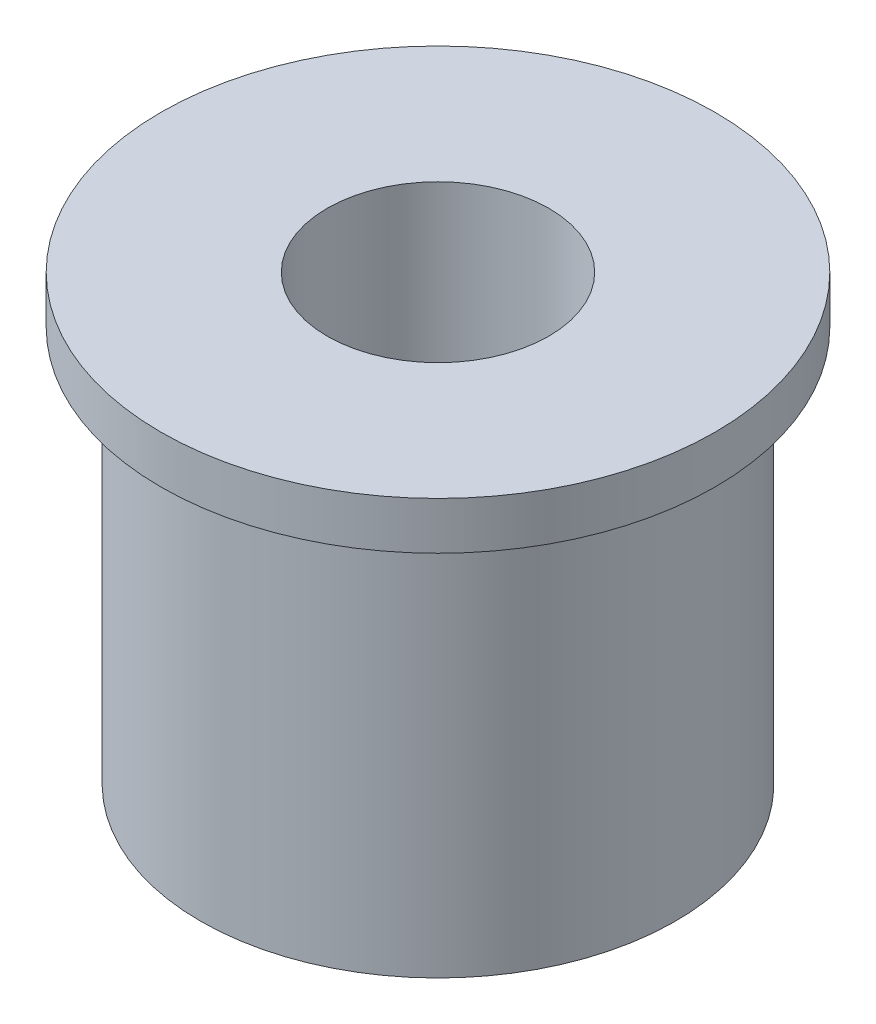
ISO-10303-21;
HEADER;
FILE_DESCRIPTION(('STEP AP214'),'2;1');
FILE_NAME('part.step','',(''),(''),'','','');
FILE_SCHEMA(('AUTOMOTIVE_DESIGN { 1 0 10303 214 1 1 1 1 }'));
ENDSEC;
DATA;
#1=APPLICATION_CONTEXT('core data for automotive mechanical design processes');
#2=APPLICATION_PROTOCOL_DEFINITION('international standard','automotive_design',2000,#1);
#3=PRODUCT_CONTEXT('',#1,'mechanical');
#4=PRODUCT('Part','Part','',(#3));
#5=PRODUCT_RELATED_PRODUCT_CATEGORY('part','',(#4));
#6=PRODUCT_DEFINITION_FORMATION('','',#4);
#7=PRODUCT_DEFINITION_CONTEXT('part definition',#1,'design');
#8=PRODUCT_DEFINITION('design','',#6,#7);
#9=PRODUCT_DEFINITION_SHAPE('','',#8);
#10=(LENGTH_UNIT() NAMED_UNIT(*) SI_UNIT(.MILLI.,.METRE.));
#11=(NAMED_UNIT(*) PLANE_ANGLE_UNIT() SI_UNIT($,.RADIAN.));
#12=(NAMED_UNIT(*) SI_UNIT($,.STERADIAN.) SOLID_ANGLE_UNIT());
#13=UNCERTAINTY_MEASURE_WITH_UNIT(LENGTH_MEASURE(1.E-05),#10,'distance_accuracy_value','');
#14=(GEOMETRIC_REPRESENTATION_CONTEXT(3) GLOBAL_UNCERTAINTY_ASSIGNED_CONTEXT((#13)) GLOBAL_UNIT_ASSIGNED_CONTEXT((#10,
#11,#12)) REPRESENTATION_CONTEXT('',''));
#15=CARTESIAN_POINT('',(0.,0.,0.));
#16=DIRECTION('',(0.,0.,1.));
#17=DIRECTION('',(1.,0.,0.));
#18=AXIS2_PLACEMENT_3D('',#15,#16,#17);
#19=CARTESIAN_POINT('',(0.,0.,0.));
#20=DIRECTION('',(0.,1.,0.));
#21=DIRECTION('',(0.,0.,1.));
#22=AXIS2_PLACEMENT_3D('',#19,#20,#21);
#23=PLANE('',#22);
#24=CARTESIAN_POINT('',(0.,0.,0.));
#25=DIRECTION('',(0.,1.,0.));
#26=DIRECTION('',(0.,0.,1.));
#27=AXIS2_PLACEMENT_3D('',#24,#25,#26);
#28=CIRCLE('',#27,3.);
#29=CARTESIAN_POINT('',(0.,0.,3.));
#30=VERTEX_POINT('',#29);
#31=EDGE_CURVE('E36',#30,#30,#28,.T.);
#32=ORIENTED_EDGE('',*,*,#31,.F.);
#33=EDGE_LOOP('',(#32));
#34=FACE_BOUND('',#33,.T.);
#35=CARTESIAN_POINT('',(0.,0.,0.));
#36=DIRECTION('',(0.,1.,0.));
#37=DIRECTION('',(0.,0.,1.));
#38=AXIS2_PLACEMENT_3D('',#35,#36,#37);
#39=CIRCLE('',#38,1.4);
#40=CARTESIAN_POINT('',(0.,0.,1.4));
#41=VERTEX_POINT('',#40);
#42=EDGE_CURVE('E43',#41,#41,#39,.T.);
#43=ORIENTED_EDGE('',*,*,#42,.T.);
#44=EDGE_LOOP('',(#43));
#45=FACE_BOUND('',#44,.T.);
#46=ADVANCED_FACE('F32',(#34,#45),#23,.F.);
#47=CARTESIAN_POINT('',(0.,5.,0.));
#48=DIRECTION('',(0.,-1.,0.));
#49=DIRECTION('',(0.,0.,-1.));
#50=AXIS2_PLACEMENT_3D('',#47,#48,#49);
#51=CYLINDRICAL_SURFACE('',#50,3.);
#52=CARTESIAN_POINT('',(0.,5.,0.));
#53=DIRECTION('',(0.,1.,0.));
#54=DIRECTION('',(0.,0.,1.));
#55=AXIS2_PLACEMENT_3D('',#52,#53,#54);
#56=CIRCLE('',#55,3.);
#57=CARTESIAN_POINT('',(0.,5.,3.));
#58=VERTEX_POINT('',#57);
#59=EDGE_CURVE('E10',#58,#58,#56,.T.);
#60=ORIENTED_EDGE('',*,*,#59,.F.);
#61=EDGE_LOOP('',(#60));
#62=FACE_BOUND('',#61,.T.);
#63=ORIENTED_EDGE('',*,*,#31,.T.);
#64=EDGE_LOOP('',(#63));
#65=FACE_BOUND('',#64,.T.);
#66=ADVANCED_FACE('F34',(#62,#65),#51,.T.);
#67=CARTESIAN_POINT('',(0.,5.,0.));
#68=DIRECTION('',(0.,-1.,0.));
#69=DIRECTION('',(0.,0.,-1.));
#70=AXIS2_PLACEMENT_3D('',#67,#68,#69);
#71=CYLINDRICAL_SURFACE('',#70,1.4);
#72=ORIENTED_EDGE('',*,*,#42,.F.);
#73=EDGE_LOOP('',(#72));
#74=FACE_BOUND('',#73,.T.);
#75=CARTESIAN_POINT('',(0.,5.6,0.));
#76=DIRECTION('',(0.,1.,0.));
#77=DIRECTION('',(0.,0.,1.));
#78=AXIS2_PLACEMENT_3D('',#75,#76,#77);
#79=CIRCLE('',#78,1.4);
#80=CARTESIAN_POINT('',(0.,5.6,1.4));
#81=VERTEX_POINT('',#80);
#82=EDGE_CURVE('E51',#81,#81,#79,.T.);
#83=ORIENTED_EDGE('',*,*,#82,.T.);
#84=EDGE_LOOP('',(#83));
#85=FACE_BOUND('',#84,.T.);
#86=ADVANCED_FACE('F57',(#74,#85),#71,.F.);
#87=CARTESIAN_POINT('',(0.,5.6,0.));
#88=DIRECTION('',(0.,1.,0.));
#89=DIRECTION('',(0.,0.,1.));
#90=AXIS2_PLACEMENT_3D('',#87,#88,#89);
#91=PLANE('',#90);
#92=CARTESIAN_POINT('',(0.,5.6,0.));
#93=DIRECTION('',(0.,1.,0.));
#94=DIRECTION('',(0.,0.,1.));
#95=AXIS2_PLACEMENT_3D('',#92,#93,#94);
#96=CIRCLE('',#95,3.5);
#97=CARTESIAN_POINT('',(0.,5.6,3.5));
#98=VERTEX_POINT('',#97);
#99=EDGE_CURVE('E47',#98,#98,#96,.T.);
#100=ORIENTED_EDGE('',*,*,#99,.T.);
#101=EDGE_LOOP('',(#100));
#102=FACE_BOUND('',#101,.T.);
#103=ORIENTED_EDGE('',*,*,#82,.F.);
#104=EDGE_LOOP('',(#103));
#105=FACE_BOUND('',#104,.T.);
#106=ADVANCED_FACE('F59',(#102,#105),#91,.T.);
#107=CARTESIAN_POINT('',(0.,5.,0.));
#108=DIRECTION('',(0.,1.,0.));
#109=DIRECTION('',(0.,0.,1.));
#110=AXIS2_PLACEMENT_3D('',#107,#108,#109);
#111=PLANE('',#110);
#112=ORIENTED_EDGE('',*,*,#59,.T.);
#113=EDGE_LOOP('',(#112));
#114=FACE_BOUND('',#113,.T.);
#115=CARTESIAN_POINT('',(0.,5.,0.));
#116=DIRECTION('',(0.,1.,0.));
#117=DIRECTION('',(0.,0.,1.));
#118=AXIS2_PLACEMENT_3D('',#115,#116,#117);
#119=CIRCLE('',#118,3.5);
#120=CARTESIAN_POINT('',(0.,5.,3.5));
#121=VERTEX_POINT('',#120);
#122=EDGE_CURVE('E48',#121,#121,#119,.T.);
#123=ORIENTED_EDGE('',*,*,#122,.F.);
#124=EDGE_LOOP('',(#123));
#125=FACE_BOUND('',#124,.T.);
#126=ADVANCED_FACE('F61',(#114,#125),#111,.F.);
#127=CARTESIAN_POINT('',(0.,5.6,0.));
#128=DIRECTION('',(0.,-1.,0.));
#129=DIRECTION('',(0.,0.,-1.));
#130=AXIS2_PLACEMENT_3D('',#127,#128,#129);
#131=CYLINDRICAL_SURFACE('',#130,3.5);
#132=ORIENTED_EDGE('',*,*,#99,.F.);
#133=EDGE_LOOP('',(#132));
#134=FACE_BOUND('',#133,.T.);
#135=ORIENTED_EDGE('',*,*,#122,.T.);
#136=EDGE_LOOP('',(#135));
#137=FACE_BOUND('',#136,.T.);
#138=ADVANCED_FACE('F68',(#134,#137),#131,.T.);
#139=CLOSED_SHELL('',(#46,#66,#86,#106,#126,#138));
#140=MANIFOLD_SOLID_BREP('B2',#139);
#141=ADVANCED_BREP_SHAPE_REPRESENTATION('',(#18,#140),#14);
#142=SHAPE_DEFINITION_REPRESENTATION(#9,#141);
ENDSEC;
END-ISO-10303-21;
